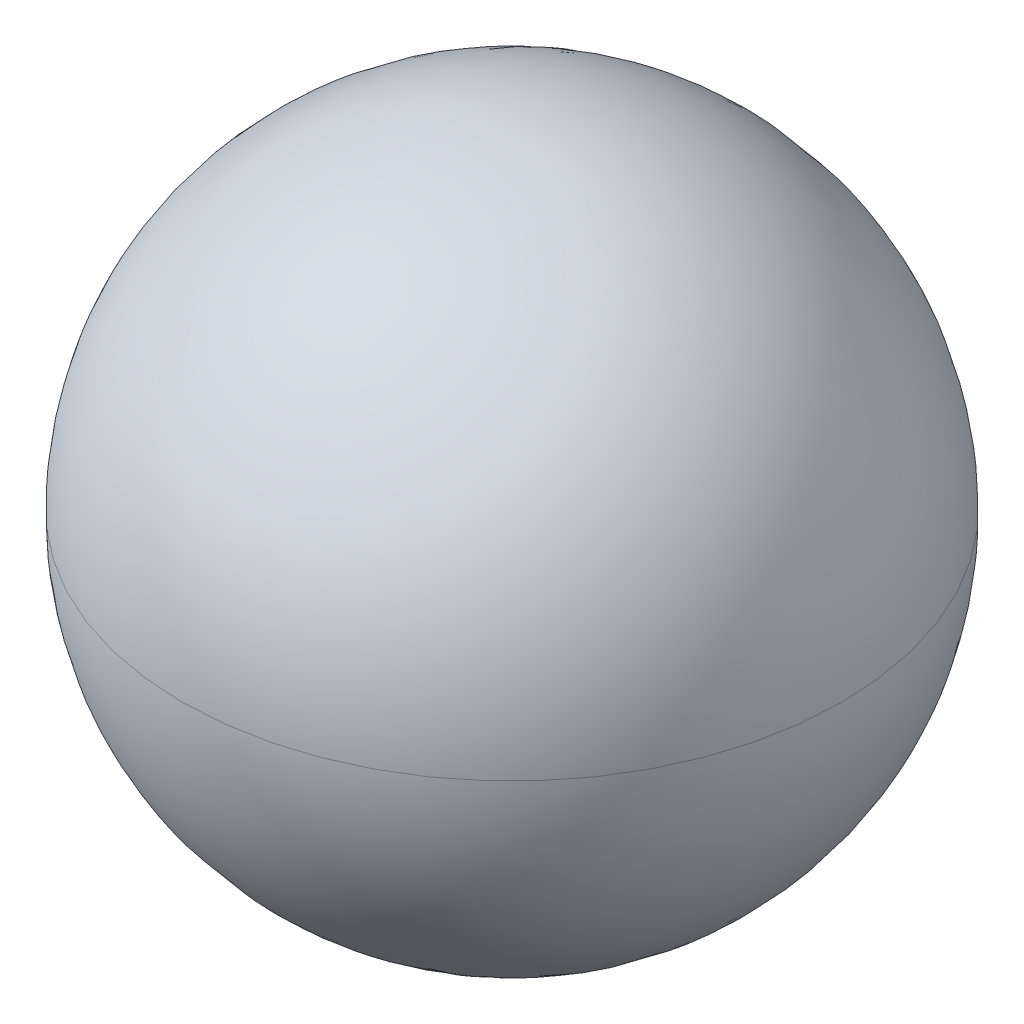
ISO-10303-21;
HEADER;
FILE_DESCRIPTION(('STEP AP214'),'2;1');
FILE_NAME('part.step','',(''),(''),'','','');
FILE_SCHEMA(('AUTOMOTIVE_DESIGN { 1 0 10303 214 1 1 1 1 }'));
ENDSEC;
DATA;
#1=APPLICATION_CONTEXT('core data for automotive mechanical design processes');
#2=APPLICATION_PROTOCOL_DEFINITION('international standard','automotive_design',2000,#1);
#3=PRODUCT_CONTEXT('',#1,'mechanical');
#4=PRODUCT('Part','Part','',(#3));
#5=PRODUCT_RELATED_PRODUCT_CATEGORY('part','',(#4));
#6=PRODUCT_DEFINITION_FORMATION('','',#4);
#7=PRODUCT_DEFINITION_CONTEXT('part definition',#1,'design');
#8=PRODUCT_DEFINITION('design','',#6,#7);
#9=PRODUCT_DEFINITION_SHAPE('','',#8);
#10=(LENGTH_UNIT() NAMED_UNIT(*) SI_UNIT(.MILLI.,.METRE.));
#11=(NAMED_UNIT(*) PLANE_ANGLE_UNIT() SI_UNIT($,.RADIAN.));
#12=(NAMED_UNIT(*) SI_UNIT($,.STERADIAN.) SOLID_ANGLE_UNIT());
#13=UNCERTAINTY_MEASURE_WITH_UNIT(LENGTH_MEASURE(1.E-05),#10,'distance_accuracy_value','');
#14=(GEOMETRIC_REPRESENTATION_CONTEXT(3) GLOBAL_UNCERTAINTY_ASSIGNED_CONTEXT((#13)) GLOBAL_UNIT_ASSIGNED_CONTEXT((#10,
#11,#12)) REPRESENTATION_CONTEXT('',''));
#15=CARTESIAN_POINT('',(0.,0.,0.));
#16=DIRECTION('',(0.,0.,1.));
#17=DIRECTION('',(1.,0.,0.));
#18=AXIS2_PLACEMENT_3D('',#15,#16,#17);
#19=CARTESIAN_POINT('',(42.979937912543,32.00024028048,1.346800003052));
#20=CARTESIAN_POINT('',(42.979937912543,32.00024028048,1.346800003052));
#21=CARTESIAN_POINT('',(42.979937912543,32.00024028048,1.346800003052));
#22=CARTESIAN_POINT('',(42.979937912543,32.00024028048,1.346800003052));
#23=CARTESIAN_POINT('',(42.979937912543,32.00024028048,1.034800003052));
#24=CARTESIAN_POINT('',(42.979937912543,31.37624028048,1.034800003052));
#25=CARTESIAN_POINT('',(42.979937912543,31.37624028048,1.658800003052));
#26=CARTESIAN_POINT('',(42.979937912543,32.00024028048,1.658800003052));
#27=CARTESIAN_POINT('',(43.291937912543,32.00024028048,1.034800003052));
#28=CARTESIAN_POINT('',(43.291937912543,31.37624028048,1.034800003052));
#29=CARTESIAN_POINT('',(43.291937912543,31.37624028048,1.658800003052));
#30=CARTESIAN_POINT('',(43.291937912543,32.00024028048,1.658800003052));
#31=CARTESIAN_POINT('',(43.291937912543,32.00024028048,1.346800003052));
#32=CARTESIAN_POINT('',(43.291937912543,32.00024028048,1.346800003052));
#33=CARTESIAN_POINT('',(43.291937912543,32.00024028048,1.346800003052));
#34=CARTESIAN_POINT('',(43.291937912543,32.00024028048,1.346800003052));
#35=(BOUNDED_SURFACE() B_SPLINE_SURFACE(3,3,((#19,#20,#21,#22),(#23,#24,#25,#26),(#27,#28,#29,
#30),(#31,#32,#33,#34)),.UNSPECIFIED.,.F.,.F.,.F.) B_SPLINE_SURFACE_WITH_KNOTS((4,4),(4,4),(0.,
1.),(0.,1.),.UNSPECIFIED.) GEOMETRIC_REPRESENTATION_ITEM() RATIONAL_B_SPLINE_SURFACE(((1.,
0.333333333333,0.333333333333,1.),(0.333333333333,0.111111111111,0.111111111111,0.333333333333),
(0.333333333333,0.111111111111,0.111111111111,0.333333333333),(1.,0.333333333333,0.333333333333,1.))) REPRESENTATION_ITEM('') SURFACE());
#36=CARTESIAN_POINT('',(43.135937912543,32.00024028048,1.346800003052));
#37=DIRECTION('',(0.,1.,0.));
#38=DIRECTION('',(-1.,0.,0.));
#39=AXIS2_PLACEMENT_3D('',#36,#37,#38);
#40=CIRCLE('',#39,0.156);
#41=CARTESIAN_POINT('',(42.979937912543,32.00024028048,1.346800003052));
#42=VERTEX_POINT('',#41);
#43=CARTESIAN_POINT('',(43.291937912543,32.00024028048,1.346800003052));
#44=VERTEX_POINT('',#43);
#45=EDGE_CURVE('E11',#42,#44,#40,.T.);
#46=CARTESIAN_POINT('',(43.135937912543,32.00024028048,1.346800003052));
#47=DIRECTION('',(0.,-1.,0.));
#48=DIRECTION('',(-1.,0.,0.));
#49=AXIS2_PLACEMENT_3D('',#46,#47,#48);
#50=CIRCLE('',#49,0.156);
#51=EDGE_CURVE('E28',#42,#44,#50,.T.);
#52=ORIENTED_EDGE('',*,*,#45,.F.);
#53=ORIENTED_EDGE('',*,*,#51,.T.);
#54=EDGE_LOOP('',(#52,#53));
#55=FACE_BOUND('',#54,.T.);
#56=ADVANCED_FACE('F17',(#55),#35,.T.);
#57=CARTESIAN_POINT('',(42.979937912543,32.00024028048,1.346800003052));
#58=CARTESIAN_POINT('',(42.979937912543,32.00024028048,1.346800003052));
#59=CARTESIAN_POINT('',(42.979937912543,32.00024028048,1.346800003052));
#60=CARTESIAN_POINT('',(42.979937912543,32.00024028048,1.346800003052));
#61=CARTESIAN_POINT('',(42.979937912543,32.00024028048,1.658800003052));
#62=CARTESIAN_POINT('',(42.979937912543,32.62424028048,1.658800003052));
#63=CARTESIAN_POINT('',(42.979937912543,32.62424028048,1.034800003052));
#64=CARTESIAN_POINT('',(42.979937912543,32.00024028048,1.034800003052));
#65=CARTESIAN_POINT('',(43.291937912543,32.00024028048,1.658800003052));
#66=CARTESIAN_POINT('',(43.291937912543,32.62424028048,1.658800003052));
#67=CARTESIAN_POINT('',(43.291937912543,32.62424028048,1.034800003052));
#68=CARTESIAN_POINT('',(43.291937912543,32.00024028048,1.034800003052));
#69=CARTESIAN_POINT('',(43.291937912543,32.00024028048,1.346800003052));
#70=CARTESIAN_POINT('',(43.291937912543,32.00024028048,1.346800003052));
#71=CARTESIAN_POINT('',(43.291937912543,32.00024028048,1.346800003052));
#72=CARTESIAN_POINT('',(43.291937912543,32.00024028048,1.346800003052));
#73=(BOUNDED_SURFACE() B_SPLINE_SURFACE(3,3,((#57,#58,#59,#60),(#61,#62,#63,#64),(#65,#66,#67,
#68),(#69,#70,#71,#72)),.UNSPECIFIED.,.F.,.F.,.F.) B_SPLINE_SURFACE_WITH_KNOTS((4,4),(4,4),(0.,
1.),(0.,1.),.UNSPECIFIED.) GEOMETRIC_REPRESENTATION_ITEM() RATIONAL_B_SPLINE_SURFACE(((1.,
0.333333333333,0.333333333333,1.),(0.333333333333,0.111111111111,0.111111111111,0.333333333333),
(0.333333333333,0.111111111111,0.111111111111,0.333333333333),(1.,0.333333333333,0.333333333333,1.))) REPRESENTATION_ITEM('') SURFACE());
#74=ORIENTED_EDGE('',*,*,#51,.F.);
#75=ORIENTED_EDGE('',*,*,#45,.T.);
#76=EDGE_LOOP('',(#74,#75));
#77=FACE_BOUND('',#76,.T.);
#78=ADVANCED_FACE('F19',(#77),#73,.T.);
#79=CLOSED_SHELL('',(#56,#78));
#80=MANIFOLD_SOLID_BREP('B1',#79);
#81=ADVANCED_BREP_SHAPE_REPRESENTATION('',(#18,#80),#14);
#82=SHAPE_DEFINITION_REPRESENTATION(#9,#81);
ENDSEC;
END-ISO-10303-21;
